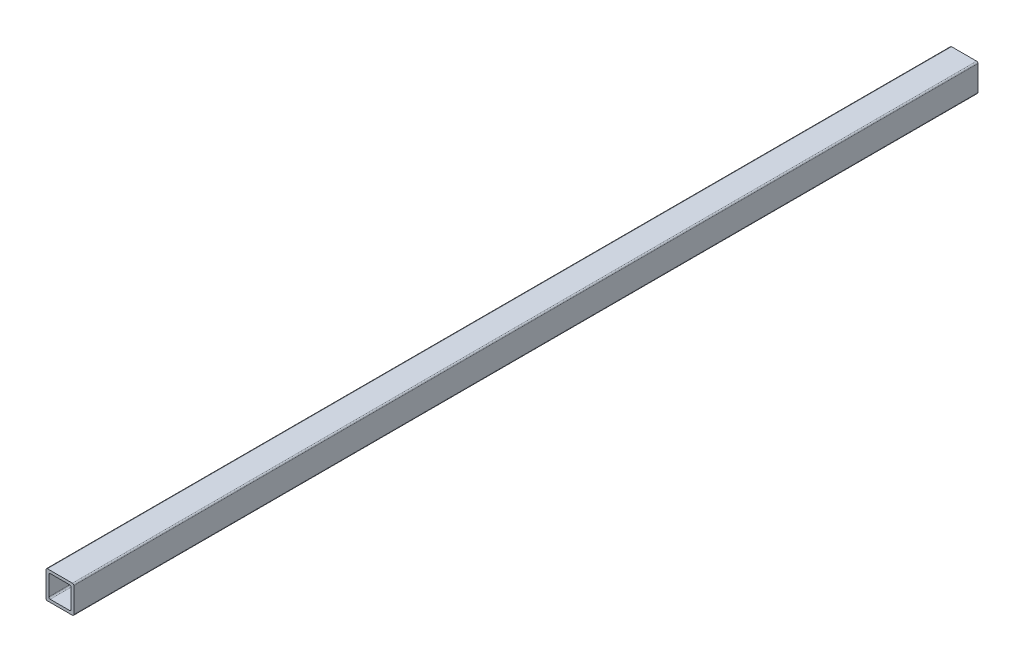
ISO-10303-21;
HEADER;
FILE_DESCRIPTION(('STEP AP214'),'2;1');
FILE_NAME('part.step','',(''),(''),'','','');
FILE_SCHEMA(('AUTOMOTIVE_DESIGN { 1 0 10303 214 1 1 1 1 }'));
ENDSEC;
DATA;
#1=APPLICATION_CONTEXT('core data for automotive mechanical design processes');
#2=APPLICATION_PROTOCOL_DEFINITION('international standard','automotive_design',2000,#1);
#3=PRODUCT_CONTEXT('',#1,'mechanical');
#4=PRODUCT('Part','Part','',(#3));
#5=PRODUCT_RELATED_PRODUCT_CATEGORY('part','',(#4));
#6=PRODUCT_DEFINITION_FORMATION('','',#4);
#7=PRODUCT_DEFINITION_CONTEXT('part definition',#1,'design');
#8=PRODUCT_DEFINITION('design','',#6,#7);
#9=PRODUCT_DEFINITION_SHAPE('','',#8);
#10=(LENGTH_UNIT() NAMED_UNIT(*) SI_UNIT(.MILLI.,.METRE.));
#11=(NAMED_UNIT(*) PLANE_ANGLE_UNIT() SI_UNIT($,.RADIAN.));
#12=(NAMED_UNIT(*) SI_UNIT($,.STERADIAN.) SOLID_ANGLE_UNIT());
#13=UNCERTAINTY_MEASURE_WITH_UNIT(LENGTH_MEASURE(1.E-05),#10,'distance_accuracy_value','');
#14=(GEOMETRIC_REPRESENTATION_CONTEXT(3) GLOBAL_UNCERTAINTY_ASSIGNED_CONTEXT((#13)) GLOBAL_UNIT_ASSIGNED_CONTEXT((#10,
#11,#12)) REPRESENTATION_CONTEXT('',''));
#15=CARTESIAN_POINT('',(0.,0.,0.));
#16=DIRECTION('',(0.,0.,1.));
#17=DIRECTION('',(1.,0.,0.));
#18=AXIS2_PLACEMENT_3D('',#15,#16,#17);
#19=CARTESIAN_POINT('',(2.,2.,1300.));
#20=DIRECTION('',(0.,0.,-1.));
#21=DIRECTION('',(-1.,0.,0.));
#22=AXIS2_PLACEMENT_3D('',#19,#20,#21);
#23=PLANE('',#22);
#24=CARTESIAN_POINT('',(2.,2.,1300.));
#25=DIRECTION('',(0.,0.,1.));
#26=DIRECTION('',(-1.,0.,0.));
#27=AXIS2_PLACEMENT_3D('',#24,#25,#26);
#28=CIRCLE('',#27,2.);
#29=CARTESIAN_POINT('',(0.,2.00000000000001,1300.));
#30=VERTEX_POINT('',#29);
#31=CARTESIAN_POINT('',(2.00000000000001,0.,1300.));
#32=VERTEX_POINT('',#31);
#33=EDGE_CURVE('E211',#30,#32,#28,.T.);
#34=ORIENTED_EDGE('',*,*,#33,.T.);
#35=DIRECTION('',(1.,0.,0.));
#36=VECTOR('',#35,1.);
#37=CARTESIAN_POINT('',(2.00000000000001,0.,1300.));
#38=LINE('',#37,#36);
#39=CARTESIAN_POINT('',(38.,0.,1300.));
#40=VERTEX_POINT('',#39);
#41=EDGE_CURVE('E214',#32,#40,#38,.T.);
#42=ORIENTED_EDGE('',*,*,#41,.T.);
#43=CARTESIAN_POINT('',(38.,2.,1300.));
#44=DIRECTION('',(0.,0.,1.));
#45=DIRECTION('',(-1.,0.,0.));
#46=AXIS2_PLACEMENT_3D('',#43,#44,#45);
#47=CIRCLE('',#46,2.);
#48=CARTESIAN_POINT('',(40.,2.00000000000001,1300.));
#49=VERTEX_POINT('',#48);
#50=EDGE_CURVE('E217',#40,#49,#47,.T.);
#51=ORIENTED_EDGE('',*,*,#50,.T.);
#52=DIRECTION('',(0.,1.,0.));
#53=VECTOR('',#52,1.);
#54=CARTESIAN_POINT('',(40.,2.00000000000001,1300.));
#55=LINE('',#54,#53);
#56=CARTESIAN_POINT('',(40.,38.,1300.));
#57=VERTEX_POINT('',#56);
#58=EDGE_CURVE('E219',#49,#57,#55,.T.);
#59=ORIENTED_EDGE('',*,*,#58,.T.);
#60=CARTESIAN_POINT('',(38.,38.,1300.));
#61=DIRECTION('',(0.,0.,1.));
#62=DIRECTION('',(-1.,0.,0.));
#63=AXIS2_PLACEMENT_3D('',#60,#61,#62);
#64=CIRCLE('',#63,2.);
#65=CARTESIAN_POINT('',(38.,40.,1300.));
#66=VERTEX_POINT('',#65);
#67=EDGE_CURVE('E221',#57,#66,#64,.T.);
#68=ORIENTED_EDGE('',*,*,#67,.T.);
#69=DIRECTION('',(-1.,0.,0.));
#70=VECTOR('',#69,1.);
#71=CARTESIAN_POINT('',(2.00000000000001,40.,1300.));
#72=LINE('',#71,#70);
#73=CARTESIAN_POINT('',(2.00000000000001,40.,1300.));
#74=VERTEX_POINT('',#73);
#75=EDGE_CURVE('E223',#66,#74,#72,.T.);
#76=ORIENTED_EDGE('',*,*,#75,.T.);
#77=CARTESIAN_POINT('',(2.,38.,1300.));
#78=DIRECTION('',(0.,0.,1.));
#79=DIRECTION('',(-1.,0.,0.));
#80=AXIS2_PLACEMENT_3D('',#77,#78,#79);
#81=CIRCLE('',#80,2.);
#82=CARTESIAN_POINT('',(0.,38.,1300.));
#83=VERTEX_POINT('',#82);
#84=EDGE_CURVE('E225',#74,#83,#81,.T.);
#85=ORIENTED_EDGE('',*,*,#84,.T.);
#86=DIRECTION('',(0.,-1.,0.));
#87=VECTOR('',#86,1.);
#88=CARTESIAN_POINT('',(0.,2.00000000000001,1300.));
#89=LINE('',#88,#87);
#90=EDGE_CURVE('E227',#83,#30,#89,.T.);
#91=ORIENTED_EDGE('',*,*,#90,.T.);
#92=EDGE_LOOP('',(#34,#42,#51,#59,#68,#76,#85,#91));
#93=FACE_BOUND('',#92,.T.);
#94=CARTESIAN_POINT('',(34.,6.,1300.));
#95=DIRECTION('',(0.,0.,1.));
#96=DIRECTION('',(1.,0.,0.));
#97=AXIS2_PLACEMENT_3D('',#94,#95,#96);
#98=CIRCLE('',#97,2.);
#99=CARTESIAN_POINT('',(34.,4.,1300.));
#100=VERTEX_POINT('',#99);
#101=CARTESIAN_POINT('',(36.,6.00000000000001,1300.));
#102=VERTEX_POINT('',#101);
#103=EDGE_CURVE('E146',#100,#102,#98,.T.);
#104=ORIENTED_EDGE('',*,*,#103,.F.);
#105=DIRECTION('',(1.,0.,0.));
#106=VECTOR('',#105,1.);
#107=CARTESIAN_POINT('',(6.00000000000001,4.,1300.));
#108=LINE('',#107,#106);
#109=CARTESIAN_POINT('',(6.00000000000001,4.,1300.));
#110=VERTEX_POINT('',#109);
#111=EDGE_CURVE('E179',#110,#100,#108,.T.);
#112=ORIENTED_EDGE('',*,*,#111,.F.);
#113=CARTESIAN_POINT('',(6.,6.,1300.));
#114=DIRECTION('',(0.,0.,1.));
#115=DIRECTION('',(1.,0.,0.));
#116=AXIS2_PLACEMENT_3D('',#113,#114,#115);
#117=CIRCLE('',#116,2.);
#118=CARTESIAN_POINT('',(4.,6.00000000000001,1300.));
#119=VERTEX_POINT('',#118);
#120=EDGE_CURVE('E177',#119,#110,#117,.T.);
#121=ORIENTED_EDGE('',*,*,#120,.F.);
#122=DIRECTION('',(0.,-1.,0.));
#123=VECTOR('',#122,1.);
#124=CARTESIAN_POINT('',(4.,6.00000000000001,1300.));
#125=LINE('',#124,#123);
#126=CARTESIAN_POINT('',(4.,34.,1300.));
#127=VERTEX_POINT('',#126);
#128=EDGE_CURVE('E175',#127,#119,#125,.T.);
#129=ORIENTED_EDGE('',*,*,#128,.F.);
#130=CARTESIAN_POINT('',(6.,34.,1300.));
#131=DIRECTION('',(0.,0.,1.));
#132=DIRECTION('',(1.,0.,0.));
#133=AXIS2_PLACEMENT_3D('',#130,#131,#132);
#134=CIRCLE('',#133,2.);
#135=CARTESIAN_POINT('',(6.00000000000001,36.,1300.));
#136=VERTEX_POINT('',#135);
#137=EDGE_CURVE('E173',#136,#127,#134,.T.);
#138=ORIENTED_EDGE('',*,*,#137,.F.);
#139=DIRECTION('',(-1.,0.,0.));
#140=VECTOR('',#139,1.);
#141=CARTESIAN_POINT('',(6.00000000000001,36.,1300.));
#142=LINE('',#141,#140);
#143=CARTESIAN_POINT('',(34.,36.,1300.));
#144=VERTEX_POINT('',#143);
#145=EDGE_CURVE('E169',#144,#136,#142,.T.);
#146=ORIENTED_EDGE('',*,*,#145,.F.);
#147=CARTESIAN_POINT('',(34.,34.,1300.));
#148=DIRECTION('',(0.,0.,1.));
#149=DIRECTION('',(1.,0.,0.));
#150=AXIS2_PLACEMENT_3D('',#147,#148,#149);
#151=CIRCLE('',#150,2.);
#152=CARTESIAN_POINT('',(36.,34.,1300.));
#153=VERTEX_POINT('',#152);
#154=EDGE_CURVE('E167',#153,#144,#151,.T.);
#155=ORIENTED_EDGE('',*,*,#154,.F.);
#156=DIRECTION('',(0.,1.,0.));
#157=VECTOR('',#156,1.);
#158=CARTESIAN_POINT('',(36.,6.00000000000001,1300.));
#159=LINE('',#158,#157);
#160=EDGE_CURVE('E154',#102,#153,#159,.T.);
#161=ORIENTED_EDGE('',*,*,#160,.F.);
#162=EDGE_LOOP('',(#104,#112,#121,#129,#138,#146,#155,#161));
#163=FACE_BOUND('',#162,.T.);
#164=ADVANCED_FACE('F33',(#93,#163),#23,.F.);
#165=CARTESIAN_POINT('',(2.,2.,0.));
#166=DIRECTION('',(0.,0.,-1.));
#167=DIRECTION('',(-1.,0.,0.));
#168=AXIS2_PLACEMENT_3D('',#165,#166,#167);
#169=PLANE('',#168);
#170=CARTESIAN_POINT('',(2.,2.,0.));
#171=DIRECTION('',(0.,0.,1.));
#172=DIRECTION('',(-1.,0.,0.));
#173=AXIS2_PLACEMENT_3D('',#170,#171,#172);
#174=CIRCLE('',#173,2.);
#175=CARTESIAN_POINT('',(0.,2.00000000000001,0.));
#176=VERTEX_POINT('',#175);
#177=CARTESIAN_POINT('',(2.00000000000001,0.,0.));
#178=VERTEX_POINT('',#177);
#179=EDGE_CURVE('E162',#176,#178,#174,.T.);
#180=ORIENTED_EDGE('',*,*,#179,.F.);
#181=DIRECTION('',(0.,-1.,0.));
#182=VECTOR('',#181,1.);
#183=CARTESIAN_POINT('',(0.,2.00000000000001,0.));
#184=LINE('',#183,#182);
#185=CARTESIAN_POINT('',(0.,38.,0.));
#186=VERTEX_POINT('',#185);
#187=EDGE_CURVE('E215',#186,#176,#184,.T.);
#188=ORIENTED_EDGE('',*,*,#187,.F.);
#189=CARTESIAN_POINT('',(2.,38.,0.));
#190=DIRECTION('',(0.,0.,1.));
#191=DIRECTION('',(-1.,0.,0.));
#192=AXIS2_PLACEMENT_3D('',#189,#190,#191);
#193=CIRCLE('',#192,2.);
#194=CARTESIAN_POINT('',(2.00000000000001,40.,0.));
#195=VERTEX_POINT('',#194);
#196=EDGE_CURVE('E242',#195,#186,#193,.T.);
#197=ORIENTED_EDGE('',*,*,#196,.F.);
#198=DIRECTION('',(-1.,0.,0.));
#199=VECTOR('',#198,1.);
#200=CARTESIAN_POINT('',(2.00000000000001,40.,0.));
#201=LINE('',#200,#199);
#202=CARTESIAN_POINT('',(38.,40.,0.));
#203=VERTEX_POINT('',#202);
#204=EDGE_CURVE('E240',#203,#195,#201,.T.);
#205=ORIENTED_EDGE('',*,*,#204,.F.);
#206=CARTESIAN_POINT('',(38.,38.,0.));
#207=DIRECTION('',(0.,0.,1.));
#208=DIRECTION('',(-1.,0.,0.));
#209=AXIS2_PLACEMENT_3D('',#206,#207,#208);
#210=CIRCLE('',#209,2.);
#211=CARTESIAN_POINT('',(40.,38.,0.));
#212=VERTEX_POINT('',#211);
#213=EDGE_CURVE('E238',#212,#203,#210,.T.);
#214=ORIENTED_EDGE('',*,*,#213,.F.);
#215=DIRECTION('',(0.,1.,0.));
#216=VECTOR('',#215,1.);
#217=CARTESIAN_POINT('',(40.,2.00000000000001,0.));
#218=LINE('',#217,#216);
#219=CARTESIAN_POINT('',(40.,2.00000000000001,0.));
#220=VERTEX_POINT('',#219);
#221=EDGE_CURVE('E236',#220,#212,#218,.T.);
#222=ORIENTED_EDGE('',*,*,#221,.F.);
#223=CARTESIAN_POINT('',(38.,2.,0.));
#224=DIRECTION('',(0.,0.,1.));
#225=DIRECTION('',(-1.,0.,0.));
#226=AXIS2_PLACEMENT_3D('',#223,#224,#225);
#227=CIRCLE('',#226,2.);
#228=CARTESIAN_POINT('',(38.,0.,0.));
#229=VERTEX_POINT('',#228);
#230=EDGE_CURVE('E234',#229,#220,#227,.T.);
#231=ORIENTED_EDGE('',*,*,#230,.F.);
#232=DIRECTION('',(1.,0.,0.));
#233=VECTOR('',#232,1.);
#234=CARTESIAN_POINT('',(2.00000000000001,0.,0.));
#235=LINE('',#234,#233);
#236=EDGE_CURVE('E232',#178,#229,#235,.T.);
#237=ORIENTED_EDGE('',*,*,#236,.F.);
#238=EDGE_LOOP('',(#180,#188,#197,#205,#214,#222,#231,#237));
#239=FACE_BOUND('',#238,.T.);
#240=DIRECTION('',(1.,0.,0.));
#241=VECTOR('',#240,1.);
#242=CARTESIAN_POINT('',(6.00000000000001,4.,0.));
#243=LINE('',#242,#241);
#244=CARTESIAN_POINT('',(6.00000000000001,4.,0.));
#245=VERTEX_POINT('',#244);
#246=CARTESIAN_POINT('',(34.,4.,0.));
#247=VERTEX_POINT('',#246);
#248=EDGE_CURVE('E155',#245,#247,#243,.T.);
#249=ORIENTED_EDGE('',*,*,#248,.T.);
#250=CARTESIAN_POINT('',(34.,6.,0.));
#251=DIRECTION('',(0.,0.,1.));
#252=DIRECTION('',(1.,0.,0.));
#253=AXIS2_PLACEMENT_3D('',#250,#251,#252);
#254=CIRCLE('',#253,2.);
#255=CARTESIAN_POINT('',(36.,6.00000000000001,0.));
#256=VERTEX_POINT('',#255);
#257=EDGE_CURVE('E56',#247,#256,#254,.T.);
#258=ORIENTED_EDGE('',*,*,#257,.T.);
#259=DIRECTION('',(0.,1.,0.));
#260=VECTOR('',#259,1.);
#261=CARTESIAN_POINT('',(36.,6.00000000000001,0.));
#262=LINE('',#261,#260);
#263=CARTESIAN_POINT('',(36.,34.,0.));
#264=VERTEX_POINT('',#263);
#265=EDGE_CURVE('E161',#256,#264,#262,.T.);
#266=ORIENTED_EDGE('',*,*,#265,.T.);
#267=CARTESIAN_POINT('',(34.,34.,0.));
#268=DIRECTION('',(0.,0.,1.));
#269=DIRECTION('',(1.,0.,0.));
#270=AXIS2_PLACEMENT_3D('',#267,#268,#269);
#271=CIRCLE('',#270,2.);
#272=CARTESIAN_POINT('',(34.,36.,0.));
#273=VERTEX_POINT('',#272);
#274=EDGE_CURVE('E183',#264,#273,#271,.T.);
#275=ORIENTED_EDGE('',*,*,#274,.T.);
#276=DIRECTION('',(-1.,0.,0.));
#277=VECTOR('',#276,1.);
#278=CARTESIAN_POINT('',(6.00000000000001,36.,0.));
#279=LINE('',#278,#277);
#280=CARTESIAN_POINT('',(6.00000000000001,36.,0.));
#281=VERTEX_POINT('',#280);
#282=EDGE_CURVE('E186',#273,#281,#279,.T.);
#283=ORIENTED_EDGE('',*,*,#282,.T.);
#284=CARTESIAN_POINT('',(6.,34.,0.));
#285=DIRECTION('',(0.,0.,1.));
#286=DIRECTION('',(1.,0.,0.));
#287=AXIS2_PLACEMENT_3D('',#284,#285,#286);
#288=CIRCLE('',#287,2.);
#289=CARTESIAN_POINT('',(4.,34.,0.));
#290=VERTEX_POINT('',#289);
#291=EDGE_CURVE('E189',#281,#290,#288,.T.);
#292=ORIENTED_EDGE('',*,*,#291,.T.);
#293=DIRECTION('',(0.,-1.,0.));
#294=VECTOR('',#293,1.);
#295=CARTESIAN_POINT('',(4.,6.00000000000001,0.));
#296=LINE('',#295,#294);
#297=CARTESIAN_POINT('',(4.,6.00000000000001,0.));
#298=VERTEX_POINT('',#297);
#299=EDGE_CURVE('E192',#290,#298,#296,.T.);
#300=ORIENTED_EDGE('',*,*,#299,.T.);
#301=CARTESIAN_POINT('',(6.,6.,0.));
#302=DIRECTION('',(0.,0.,1.));
#303=DIRECTION('',(1.,0.,0.));
#304=AXIS2_PLACEMENT_3D('',#301,#302,#303);
#305=CIRCLE('',#304,2.);
#306=EDGE_CURVE('E195',#298,#245,#305,.T.);
#307=ORIENTED_EDGE('',*,*,#306,.T.);
#308=EDGE_LOOP('',(#249,#258,#266,#275,#283,#292,#300,#307));
#309=FACE_BOUND('',#308,.T.);
#310=ADVANCED_FACE('F272',(#239,#309),#169,.T.);
#311=CARTESIAN_POINT('',(2.,2.,1300.));
#312=DIRECTION('',(0.,0.,-1.));
#313=DIRECTION('',(-1.,0.,0.));
#314=AXIS2_PLACEMENT_3D('',#311,#312,#313);
#315=CYLINDRICAL_SURFACE('',#314,2.);
#316=ORIENTED_EDGE('',*,*,#179,.T.);
#317=DIRECTION('',(0.,0.,-1.));
#318=VECTOR('',#317,1.);
#319=CARTESIAN_POINT('',(2.00000000000001,0.,1300.));
#320=LINE('',#319,#318);
#321=EDGE_CURVE('E11',#32,#178,#320,.T.);
#322=ORIENTED_EDGE('',*,*,#321,.F.);
#323=ORIENTED_EDGE('',*,*,#33,.F.);
#324=DIRECTION('',(0.,0.,-1.));
#325=VECTOR('',#324,1.);
#326=CARTESIAN_POINT('',(0.,2.00000000000001,1300.));
#327=LINE('',#326,#325);
#328=EDGE_CURVE('E229',#30,#176,#327,.T.);
#329=ORIENTED_EDGE('',*,*,#328,.T.);
#330=EDGE_LOOP('',(#316,#322,#323,#329));
#331=FACE_BOUND('',#330,.T.);
#332=ADVANCED_FACE('F35',(#331),#315,.T.);
#333=CARTESIAN_POINT('',(2.00000000000001,0.,1300.));
#334=DIRECTION('',(0.,1.,0.));
#335=DIRECTION('',(0.,0.,1.));
#336=AXIS2_PLACEMENT_3D('',#333,#334,#335);
#337=PLANE('',#336);
#338=ORIENTED_EDGE('',*,*,#236,.T.);
#339=DIRECTION('',(0.,0.,-1.));
#340=VECTOR('',#339,1.);
#341=CARTESIAN_POINT('',(38.,0.,1300.));
#342=LINE('',#341,#340);
#343=EDGE_CURVE('E41',#40,#229,#342,.T.);
#344=ORIENTED_EDGE('',*,*,#343,.F.);
#345=ORIENTED_EDGE('',*,*,#41,.F.);
#346=ORIENTED_EDGE('',*,*,#321,.T.);
#347=EDGE_LOOP('',(#338,#344,#345,#346));
#348=FACE_BOUND('',#347,.T.);
#349=ADVANCED_FACE('F289',(#348),#337,.F.);
#350=CARTESIAN_POINT('',(38.,2.,1300.));
#351=DIRECTION('',(0.,0.,-1.));
#352=DIRECTION('',(-1.,0.,0.));
#353=AXIS2_PLACEMENT_3D('',#350,#351,#352);
#354=CYLINDRICAL_SURFACE('',#353,2.);
#355=ORIENTED_EDGE('',*,*,#230,.T.);
#356=DIRECTION('',(0.,0.,-1.));
#357=VECTOR('',#356,1.);
#358=CARTESIAN_POINT('',(40.,2.00000000000001,1300.));
#359=LINE('',#358,#357);
#360=EDGE_CURVE('E259',#49,#220,#359,.T.);
#361=ORIENTED_EDGE('',*,*,#360,.F.);
#362=ORIENTED_EDGE('',*,*,#50,.F.);
#363=ORIENTED_EDGE('',*,*,#343,.T.);
#364=EDGE_LOOP('',(#355,#361,#362,#363));
#365=FACE_BOUND('',#364,.T.);
#366=ADVANCED_FACE('F266',(#365),#354,.T.);
#367=CARTESIAN_POINT('',(40.,2.00000000000001,1300.));
#368=DIRECTION('',(-1.,0.,0.));
#369=DIRECTION('',(0.,0.,1.));
#370=AXIS2_PLACEMENT_3D('',#367,#368,#369);
#371=PLANE('',#370);
#372=ORIENTED_EDGE('',*,*,#221,.T.);
#373=DIRECTION('',(0.,0.,-1.));
#374=VECTOR('',#373,1.);
#375=CARTESIAN_POINT('',(40.,38.,1300.));
#376=LINE('',#375,#374);
#377=EDGE_CURVE('E256',#57,#212,#376,.T.);
#378=ORIENTED_EDGE('',*,*,#377,.F.);
#379=ORIENTED_EDGE('',*,*,#58,.F.);
#380=ORIENTED_EDGE('',*,*,#360,.T.);
#381=EDGE_LOOP('',(#372,#378,#379,#380));
#382=FACE_BOUND('',#381,.T.);
#383=ADVANCED_FACE('F278',(#382),#371,.F.);
#384=CARTESIAN_POINT('',(38.,38.,1300.));
#385=DIRECTION('',(0.,0.,-1.));
#386=DIRECTION('',(-1.,0.,0.));
#387=AXIS2_PLACEMENT_3D('',#384,#385,#386);
#388=CYLINDRICAL_SURFACE('',#387,2.);
#389=ORIENTED_EDGE('',*,*,#213,.T.);
#390=DIRECTION('',(0.,0.,-1.));
#391=VECTOR('',#390,1.);
#392=CARTESIAN_POINT('',(38.,40.,1300.));
#393=LINE('',#392,#391);
#394=EDGE_CURVE('E253',#66,#203,#393,.T.);
#395=ORIENTED_EDGE('',*,*,#394,.F.);
#396=ORIENTED_EDGE('',*,*,#67,.F.);
#397=ORIENTED_EDGE('',*,*,#377,.T.);
#398=EDGE_LOOP('',(#389,#395,#396,#397));
#399=FACE_BOUND('',#398,.T.);
#400=ADVANCED_FACE('F282',(#399),#388,.T.);
#401=CARTESIAN_POINT('',(2.00000000000001,40.,1300.));
#402=DIRECTION('',(0.,-1.,0.));
#403=DIRECTION('',(0.,0.,-1.));
#404=AXIS2_PLACEMENT_3D('',#401,#402,#403);
#405=PLANE('',#404);
#406=ORIENTED_EDGE('',*,*,#204,.T.);
#407=DIRECTION('',(0.,0.,-1.));
#408=VECTOR('',#407,1.);
#409=CARTESIAN_POINT('',(2.00000000000001,40.,1300.));
#410=LINE('',#409,#408);
#411=EDGE_CURVE('E250',#74,#195,#410,.T.);
#412=ORIENTED_EDGE('',*,*,#411,.F.);
#413=ORIENTED_EDGE('',*,*,#75,.F.);
#414=ORIENTED_EDGE('',*,*,#394,.T.);
#415=EDGE_LOOP('',(#406,#412,#413,#414));
#416=FACE_BOUND('',#415,.T.);
#417=ADVANCED_FACE('F302',(#416),#405,.F.);
#418=CARTESIAN_POINT('',(2.,38.,1300.));
#419=DIRECTION('',(0.,0.,-1.));
#420=DIRECTION('',(-1.,0.,0.));
#421=AXIS2_PLACEMENT_3D('',#418,#419,#420);
#422=CYLINDRICAL_SURFACE('',#421,2.);
#423=ORIENTED_EDGE('',*,*,#196,.T.);
#424=DIRECTION('',(0.,0.,-1.));
#425=VECTOR('',#424,1.);
#426=CARTESIAN_POINT('',(0.,38.,1300.));
#427=LINE('',#426,#425);
#428=EDGE_CURVE('E247',#83,#186,#427,.T.);
#429=ORIENTED_EDGE('',*,*,#428,.F.);
#430=ORIENTED_EDGE('',*,*,#84,.F.);
#431=ORIENTED_EDGE('',*,*,#411,.T.);
#432=EDGE_LOOP('',(#423,#429,#430,#431));
#433=FACE_BOUND('',#432,.T.);
#434=ADVANCED_FACE('F300',(#433),#422,.T.);
#435=CARTESIAN_POINT('',(0.,2.00000000000001,1300.));
#436=DIRECTION('',(1.,0.,0.));
#437=DIRECTION('',(0.,0.,-1.));
#438=AXIS2_PLACEMENT_3D('',#435,#436,#437);
#439=PLANE('',#438);
#440=ORIENTED_EDGE('',*,*,#187,.T.);
#441=ORIENTED_EDGE('',*,*,#328,.F.);
#442=ORIENTED_EDGE('',*,*,#90,.F.);
#443=ORIENTED_EDGE('',*,*,#428,.T.);
#444=EDGE_LOOP('',(#440,#441,#442,#443));
#445=FACE_BOUND('',#444,.T.);
#446=ADVANCED_FACE('F295',(#445),#439,.F.);
#447=CARTESIAN_POINT('',(34.,6.,1300.));
#448=DIRECTION('',(0.,0.,-1.));
#449=DIRECTION('',(-1.,0.,0.));
#450=AXIS2_PLACEMENT_3D('',#447,#448,#449);
#451=CYLINDRICAL_SURFACE('',#450,2.);
#452=ORIENTED_EDGE('',*,*,#257,.F.);
#453=DIRECTION('',(0.,0.,-1.));
#454=VECTOR('',#453,1.);
#455=CARTESIAN_POINT('',(34.,4.,1300.));
#456=LINE('',#455,#454);
#457=EDGE_CURVE('E150',#100,#247,#456,.T.);
#458=ORIENTED_EDGE('',*,*,#457,.F.);
#459=ORIENTED_EDGE('',*,*,#103,.T.);
#460=DIRECTION('',(0.,0.,-1.));
#461=VECTOR('',#460,1.);
#462=CARTESIAN_POINT('',(36.,6.00000000000001,1300.));
#463=LINE('',#462,#461);
#464=EDGE_CURVE('E149',#102,#256,#463,.T.);
#465=ORIENTED_EDGE('',*,*,#464,.T.);
#466=EDGE_LOOP('',(#452,#458,#459,#465));
#467=FACE_BOUND('',#466,.T.);
#468=ADVANCED_FACE('F148',(#467),#451,.F.);
#469=CARTESIAN_POINT('',(36.,6.00000000000001,1300.));
#470=DIRECTION('',(-1.,0.,0.));
#471=DIRECTION('',(0.,0.,1.));
#472=AXIS2_PLACEMENT_3D('',#469,#470,#471);
#473=PLANE('',#472);
#474=ORIENTED_EDGE('',*,*,#265,.F.);
#475=ORIENTED_EDGE('',*,*,#464,.F.);
#476=ORIENTED_EDGE('',*,*,#160,.T.);
#477=DIRECTION('',(0.,0.,-1.));
#478=VECTOR('',#477,1.);
#479=CARTESIAN_POINT('',(36.,34.,1300.));
#480=LINE('',#479,#478);
#481=EDGE_CURVE('E163',#153,#264,#480,.T.);
#482=ORIENTED_EDGE('',*,*,#481,.T.);
#483=EDGE_LOOP('',(#474,#475,#476,#482));
#484=FACE_BOUND('',#483,.T.);
#485=ADVANCED_FACE('F158',(#484),#473,.T.);
#486=CARTESIAN_POINT('',(34.,34.,1300.));
#487=DIRECTION('',(0.,0.,-1.));
#488=DIRECTION('',(-1.,0.,0.));
#489=AXIS2_PLACEMENT_3D('',#486,#487,#488);
#490=CYLINDRICAL_SURFACE('',#489,2.);
#491=ORIENTED_EDGE('',*,*,#274,.F.);
#492=ORIENTED_EDGE('',*,*,#481,.F.);
#493=ORIENTED_EDGE('',*,*,#154,.T.);
#494=DIRECTION('',(0.,0.,-1.));
#495=VECTOR('',#494,1.);
#496=CARTESIAN_POINT('',(34.,36.,1300.));
#497=LINE('',#496,#495);
#498=EDGE_CURVE('E208',#144,#273,#497,.T.);
#499=ORIENTED_EDGE('',*,*,#498,.T.);
#500=EDGE_LOOP('',(#491,#492,#493,#499));
#501=FACE_BOUND('',#500,.T.);
#502=ADVANCED_FACE('F327',(#501),#490,.F.);
#503=CARTESIAN_POINT('',(6.00000000000001,36.,1300.));
#504=DIRECTION('',(0.,-1.,0.));
#505=DIRECTION('',(0.,0.,-1.));
#506=AXIS2_PLACEMENT_3D('',#503,#504,#505);
#507=PLANE('',#506);
#508=ORIENTED_EDGE('',*,*,#282,.F.);
#509=ORIENTED_EDGE('',*,*,#498,.F.);
#510=ORIENTED_EDGE('',*,*,#145,.T.);
#511=DIRECTION('',(0.,0.,-1.));
#512=VECTOR('',#511,1.);
#513=CARTESIAN_POINT('',(6.00000000000001,36.,1300.));
#514=LINE('',#513,#512);
#515=EDGE_CURVE('E206',#136,#281,#514,.T.);
#516=ORIENTED_EDGE('',*,*,#515,.T.);
#517=EDGE_LOOP('',(#508,#509,#510,#516));
#518=FACE_BOUND('',#517,.T.);
#519=ADVANCED_FACE('F331',(#518),#507,.T.);
#520=CARTESIAN_POINT('',(6.,34.,1300.));
#521=DIRECTION('',(0.,0.,-1.));
#522=DIRECTION('',(-1.,0.,0.));
#523=AXIS2_PLACEMENT_3D('',#520,#521,#522);
#524=CYLINDRICAL_SURFACE('',#523,2.);
#525=ORIENTED_EDGE('',*,*,#291,.F.);
#526=ORIENTED_EDGE('',*,*,#515,.F.);
#527=ORIENTED_EDGE('',*,*,#137,.T.);
#528=DIRECTION('',(0.,0.,-1.));
#529=VECTOR('',#528,1.);
#530=CARTESIAN_POINT('',(4.,34.,1300.));
#531=LINE('',#530,#529);
#532=EDGE_CURVE('E204',#127,#290,#531,.T.);
#533=ORIENTED_EDGE('',*,*,#532,.T.);
#534=EDGE_LOOP('',(#525,#526,#527,#533));
#535=FACE_BOUND('',#534,.T.);
#536=ADVANCED_FACE('F337',(#535),#524,.F.);
#537=CARTESIAN_POINT('',(4.,6.00000000000001,1300.));
#538=DIRECTION('',(1.,0.,0.));
#539=DIRECTION('',(0.,0.,-1.));
#540=AXIS2_PLACEMENT_3D('',#537,#538,#539);
#541=PLANE('',#540);
#542=ORIENTED_EDGE('',*,*,#299,.F.);
#543=ORIENTED_EDGE('',*,*,#532,.F.);
#544=ORIENTED_EDGE('',*,*,#128,.T.);
#545=DIRECTION('',(0.,0.,-1.));
#546=VECTOR('',#545,1.);
#547=CARTESIAN_POINT('',(4.,6.00000000000001,1300.));
#548=LINE('',#547,#546);
#549=EDGE_CURVE('E202',#119,#298,#548,.T.);
#550=ORIENTED_EDGE('',*,*,#549,.T.);
#551=EDGE_LOOP('',(#542,#543,#544,#550));
#552=FACE_BOUND('',#551,.T.);
#553=ADVANCED_FACE('F341',(#552),#541,.T.);
#554=CARTESIAN_POINT('',(6.,6.,1300.));
#555=DIRECTION('',(0.,0.,-1.));
#556=DIRECTION('',(-1.,0.,0.));
#557=AXIS2_PLACEMENT_3D('',#554,#555,#556);
#558=CYLINDRICAL_SURFACE('',#557,2.);
#559=ORIENTED_EDGE('',*,*,#306,.F.);
#560=ORIENTED_EDGE('',*,*,#549,.F.);
#561=ORIENTED_EDGE('',*,*,#120,.T.);
#562=DIRECTION('',(0.,0.,-1.));
#563=VECTOR('',#562,1.);
#564=CARTESIAN_POINT('',(6.00000000000001,4.,1300.));
#565=LINE('',#564,#563);
#566=EDGE_CURVE('E48',#110,#245,#565,.T.);
#567=ORIENTED_EDGE('',*,*,#566,.T.);
#568=EDGE_LOOP('',(#559,#560,#561,#567));
#569=FACE_BOUND('',#568,.T.);
#570=ADVANCED_FACE('F345',(#569),#558,.F.);
#571=CARTESIAN_POINT('',(6.00000000000001,4.,1300.));
#572=DIRECTION('',(0.,1.,0.));
#573=DIRECTION('',(0.,0.,1.));
#574=AXIS2_PLACEMENT_3D('',#571,#572,#573);
#575=PLANE('',#574);
#576=ORIENTED_EDGE('',*,*,#248,.F.);
#577=ORIENTED_EDGE('',*,*,#566,.F.);
#578=ORIENTED_EDGE('',*,*,#111,.T.);
#579=ORIENTED_EDGE('',*,*,#457,.T.);
#580=EDGE_LOOP('',(#576,#577,#578,#579));
#581=FACE_BOUND('',#580,.T.);
#582=ADVANCED_FACE('F349',(#581),#575,.T.);
#583=CLOSED_SHELL('',(#164,#310,#332,#349,#366,#383,#400,#417,#434,#446,#468,#485,#502,#519,
#536,#553,#570,#582));
#584=MANIFOLD_SOLID_BREP('B2',#583);
#585=ADVANCED_BREP_SHAPE_REPRESENTATION('',(#18,#584),#14);
#586=SHAPE_DEFINITION_REPRESENTATION(#9,#585);
ENDSEC;
END-ISO-10303-21;
